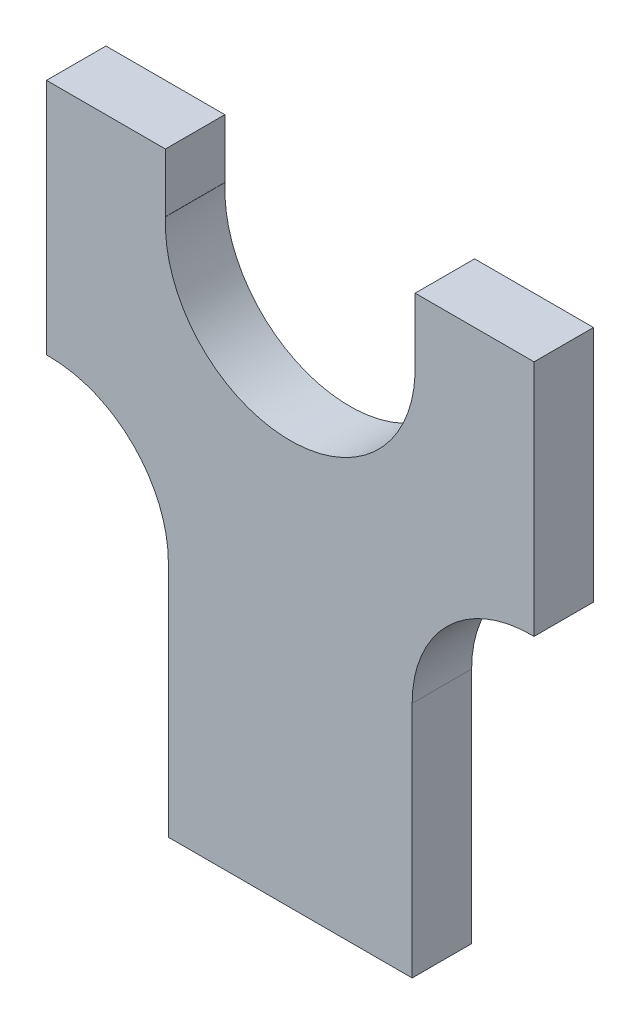
ISO-10303-21;
HEADER;
FILE_DESCRIPTION(('STEP AP214'),'2;1');
FILE_NAME('part.step','',(''),(''),'','','');
FILE_SCHEMA(('AUTOMOTIVE_DESIGN { 1 0 10303 214 1 1 1 1 }'));
ENDSEC;
DATA;
#1=APPLICATION_CONTEXT('core data for automotive mechanical design processes');
#2=APPLICATION_PROTOCOL_DEFINITION('international standard','automotive_design',2000,#1);
#3=PRODUCT_CONTEXT('',#1,'mechanical');
#4=PRODUCT('Part','Part','',(#3));
#5=PRODUCT_RELATED_PRODUCT_CATEGORY('part','',(#4));
#6=PRODUCT_DEFINITION_FORMATION('','',#4);
#7=PRODUCT_DEFINITION_CONTEXT('part definition',#1,'design');
#8=PRODUCT_DEFINITION('design','',#6,#7);
#9=PRODUCT_DEFINITION_SHAPE('','',#8);
#10=(LENGTH_UNIT() NAMED_UNIT(*) SI_UNIT(.MILLI.,.METRE.));
#11=(NAMED_UNIT(*) PLANE_ANGLE_UNIT() SI_UNIT($,.RADIAN.));
#12=(NAMED_UNIT(*) SI_UNIT($,.STERADIAN.) SOLID_ANGLE_UNIT());
#13=UNCERTAINTY_MEASURE_WITH_UNIT(LENGTH_MEASURE(1.E-05),#10,'distance_accuracy_value','');
#14=(GEOMETRIC_REPRESENTATION_CONTEXT(3) GLOBAL_UNCERTAINTY_ASSIGNED_CONTEXT((#13)) GLOBAL_UNIT_ASSIGNED_CONTEXT((#10,
#11,#12)) REPRESENTATION_CONTEXT('',''));
#15=CARTESIAN_POINT('',(0.,0.,0.));
#16=DIRECTION('',(0.,0.,1.));
#17=DIRECTION('',(1.,0.,0.));
#18=AXIS2_PLACEMENT_3D('',#15,#16,#17);
#19=CARTESIAN_POINT('',(-195.000000000006,500.,50.));
#20=DIRECTION('',(0.,-1.,0.));
#21=DIRECTION('',(0.,0.,-1.));
#22=AXIS2_PLACEMENT_3D('',#19,#20,#21);
#23=PLANE('',#22);
#24=DIRECTION('',(0.,0.,-1.));
#25=VECTOR('',#24,1.);
#26=CARTESIAN_POINT('',(-105.,500.,50.));
#27=LINE('',#26,#25);
#28=CARTESIAN_POINT('',(-105.,500.,50.));
#29=VERTEX_POINT('',#28);
#30=CARTESIAN_POINT('',(-105.,500.,0.));
#31=VERTEX_POINT('',#30);
#32=EDGE_CURVE('E159',#29,#31,#27,.T.);
#33=ORIENTED_EDGE('',*,*,#32,.T.);
#34=DIRECTION('',(-1.,0.,0.));
#35=VECTOR('',#34,1.);
#36=CARTESIAN_POINT('',(-195.000000000006,500.,0.));
#37=LINE('',#36,#35);
#38=CARTESIAN_POINT('',(-205.,500.,0.));
#39=VERTEX_POINT('',#38);
#40=EDGE_CURVE('E227',#31,#39,#37,.T.);
#41=ORIENTED_EDGE('',*,*,#40,.T.);
#42=DIRECTION('',(0.,0.,-1.));
#43=VECTOR('',#42,1.);
#44=CARTESIAN_POINT('',(-205.,500.,50.));
#45=LINE('',#44,#43);
#46=CARTESIAN_POINT('',(-205.,500.,50.));
#47=VERTEX_POINT('',#46);
#48=EDGE_CURVE('E189',#47,#39,#45,.T.);
#49=ORIENTED_EDGE('',*,*,#48,.F.);
#50=DIRECTION('',(-1.,0.,0.));
#51=VECTOR('',#50,1.);
#52=CARTESIAN_POINT('',(195.000000000006,500.,50.));
#53=LINE('',#52,#51);
#54=EDGE_CURVE('E204',#29,#47,#53,.T.);
#55=ORIENTED_EDGE('',*,*,#54,.F.);
#56=EDGE_LOOP('',(#33,#41,#49,#55));
#57=FACE_BOUND('',#56,.T.);
#58=ADVANCED_FACE('F41',(#57),#23,.F.);
#59=DIRECTION('',(0.,0.,-1.));
#60=VECTOR('',#59,1.);
#61=CARTESIAN_POINT('',(104.999999999995,500.,50.));
#62=LINE('',#61,#60);
#63=CARTESIAN_POINT('',(104.999999999995,500.,50.));
#64=VERTEX_POINT('',#63);
#65=CARTESIAN_POINT('',(104.999999999995,500.,0.));
#66=VERTEX_POINT('',#65);
#67=EDGE_CURVE('E185',#64,#66,#62,.T.);
#68=ORIENTED_EDGE('',*,*,#67,.F.);
#69=CARTESIAN_POINT('',(205.000000000008,500.,50.));
#70=VERTEX_POINT('',#69);
#71=EDGE_CURVE('E205',#70,#64,#53,.T.);
#72=ORIENTED_EDGE('',*,*,#71,.F.);
#73=DIRECTION('',(0.,0.,-1.));
#74=VECTOR('',#73,1.);
#75=CARTESIAN_POINT('',(205.000000000008,500.,50.));
#76=LINE('',#75,#74);
#77=CARTESIAN_POINT('',(205.000000000008,500.,0.));
#78=VERTEX_POINT('',#77);
#79=EDGE_CURVE('E192',#70,#78,#76,.T.);
#80=ORIENTED_EDGE('',*,*,#79,.T.);
#81=EDGE_CURVE('E228',#78,#66,#37,.T.);
#82=ORIENTED_EDGE('',*,*,#81,.T.);
#83=EDGE_LOOP('',(#68,#72,#80,#82));
#84=FACE_BOUND('',#83,.T.);
#85=ADVANCED_FACE('F319',(#84),#23,.F.);
#86=CARTESIAN_POINT('',(202.5,200.,50.));
#87=DIRECTION('',(0.,0.,-1.));
#88=DIRECTION('',(-1.,0.,0.));
#89=AXIS2_PLACEMENT_3D('',#86,#87,#88);
#90=PLANE('',#89);
#91=DIRECTION('',(0.,-1.,0.));
#92=VECTOR('',#91,1.);
#93=CARTESIAN_POINT('',(-105.,500.,50.));
#94=LINE('',#93,#92);
#95=CARTESIAN_POINT('',(-105.,450.696087881198,50.));
#96=VERTEX_POINT('',#95);
#97=EDGE_CURVE('E154',#29,#96,#94,.T.);
#98=ORIENTED_EDGE('',*,*,#97,.F.);
#99=ORIENTED_EDGE('',*,*,#54,.T.);
#100=DIRECTION('',(0.,-1.,0.));
#101=VECTOR('',#100,1.);
#102=CARTESIAN_POINT('',(-205.,300.,50.));
#103=LINE('',#102,#101);
#104=CARTESIAN_POINT('',(-205.,300.,50.));
#105=VERTEX_POINT('',#104);
#106=EDGE_CURVE('E208',#47,#105,#103,.T.);
#107=ORIENTED_EDGE('',*,*,#106,.T.);
#108=DIRECTION('',(1.,0.,0.));
#109=VECTOR('',#108,1.);
#110=CARTESIAN_POINT('',(-202.500000000001,300.,50.));
#111=LINE('',#110,#109);
#112=CARTESIAN_POINT('',(-202.500000000001,300.,50.));
#113=VERTEX_POINT('',#112);
#114=EDGE_CURVE('E210',#105,#113,#111,.T.);
#115=ORIENTED_EDGE('',*,*,#114,.T.);
#116=CARTESIAN_POINT('',(-202.5,200.,50.));
#117=DIRECTION('',(0.,0.,-1.));
#118=DIRECTION('',(1.,0.,0.));
#119=AXIS2_PLACEMENT_3D('',#116,#117,#118);
#120=CIRCLE('',#119,100.);
#121=CARTESIAN_POINT('',(-102.5,199.999999999999,50.));
#122=VERTEX_POINT('',#121);
#123=EDGE_CURVE('E212',#113,#122,#120,.T.);
#124=ORIENTED_EDGE('',*,*,#123,.T.);
#125=DIRECTION('',(0.,-1.,0.));
#126=VECTOR('',#125,1.);
#127=CARTESIAN_POINT('',(-102.5,0.,50.));
#128=LINE('',#127,#126);
#129=CARTESIAN_POINT('',(-102.5,0.,50.));
#130=VERTEX_POINT('',#129);
#131=EDGE_CURVE('E214',#122,#130,#128,.T.);
#132=ORIENTED_EDGE('',*,*,#131,.T.);
#133=DIRECTION('',(1.,0.,0.));
#134=VECTOR('',#133,1.);
#135=CARTESIAN_POINT('',(102.5,0.,50.));
#136=LINE('',#135,#134);
#137=CARTESIAN_POINT('',(102.5,0.,50.));
#138=VERTEX_POINT('',#137);
#139=EDGE_CURVE('E216',#130,#138,#136,.T.);
#140=ORIENTED_EDGE('',*,*,#139,.T.);
#141=DIRECTION('',(0.,1.,0.));
#142=VECTOR('',#141,1.);
#143=CARTESIAN_POINT('',(102.5,0.,50.));
#144=LINE('',#143,#142);
#145=CARTESIAN_POINT('',(102.5,199.999999999999,50.));
#146=VERTEX_POINT('',#145);
#147=EDGE_CURVE('E218',#138,#146,#144,.T.);
#148=ORIENTED_EDGE('',*,*,#147,.T.);
#149=CARTESIAN_POINT('',(202.5,200.,50.));
#150=DIRECTION('',(0.,0.,-1.));
#151=DIRECTION('',(-1.,0.,0.));
#152=AXIS2_PLACEMENT_3D('',#149,#150,#151);
#153=CIRCLE('',#152,100.);
#154=CARTESIAN_POINT('',(202.500000000001,300.,50.));
#155=VERTEX_POINT('',#154);
#156=EDGE_CURVE('E196',#146,#155,#153,.T.);
#157=ORIENTED_EDGE('',*,*,#156,.T.);
#158=DIRECTION('',(1.,0.,0.));
#159=VECTOR('',#158,1.);
#160=CARTESIAN_POINT('',(202.500000000001,300.,50.));
#161=LINE('',#160,#159);
#162=CARTESIAN_POINT('',(205.,300.,50.));
#163=VERTEX_POINT('',#162);
#164=EDGE_CURVE('E199',#155,#163,#161,.T.);
#165=ORIENTED_EDGE('',*,*,#164,.T.);
#166=DIRECTION('',(0.,1.,0.));
#167=VECTOR('',#166,1.);
#168=CARTESIAN_POINT('',(205.,300.,50.));
#169=LINE('',#168,#167);
#170=EDGE_CURVE('E202',#163,#70,#169,.T.);
#171=ORIENTED_EDGE('',*,*,#170,.T.);
#172=ORIENTED_EDGE('',*,*,#71,.T.);
#173=DIRECTION('',(-1.02738146572361E-13,1.,0.));
#174=VECTOR('',#173,1.);
#175=CARTESIAN_POINT('',(104.999999999995,500.,50.));
#176=LINE('',#175,#174);
#177=CARTESIAN_POINT('',(105.,450.696087881198,50.));
#178=VERTEX_POINT('',#177);
#179=EDGE_CURVE('E175',#178,#64,#176,.T.);
#180=ORIENTED_EDGE('',*,*,#179,.F.);
#181=DIRECTION('',(1.,0.,0.));
#182=VECTOR('',#181,1.);
#183=CARTESIAN_POINT('',(-105.,450.696087881198,50.));
#184=LINE('',#183,#182);
#185=CARTESIAN_POINT('',(104.85210050266,450.696087881198,50.));
#186=VERTEX_POINT('',#185);
#187=EDGE_CURVE('E162',#186,#178,#184,.T.);
#188=ORIENTED_EDGE('',*,*,#187,.F.);
#189=CARTESIAN_POINT('',(0.,445.124999999996,50.));
#190=DIRECTION('',(0.,0.,1.));
#191=DIRECTION('',(1.,0.,0.));
#192=AXIS2_PLACEMENT_3D('',#189,#190,#191);
#193=CIRCLE('',#192,105.);
#194=CARTESIAN_POINT('',(-104.85210050266,450.696087881198,50.));
#195=VERTEX_POINT('',#194);
#196=EDGE_CURVE('E168',#195,#186,#193,.T.);
#197=ORIENTED_EDGE('',*,*,#196,.F.);
#198=EDGE_CURVE('E63',#96,#195,#184,.T.);
#199=ORIENTED_EDGE('',*,*,#198,.F.);
#200=EDGE_LOOP('',(#98,#99,#107,#115,#124,#132,#140,#148,#157,#165,#171,#172,#180,#188,#197,#199));
#201=FACE_BOUND('',#200,.T.);
#202=ADVANCED_FACE('F172',(#201),#90,.F.);
#203=CARTESIAN_POINT('',(202.5,200.,0.));
#204=DIRECTION('',(0.,0.,-1.));
#205=DIRECTION('',(-1.,0.,0.));
#206=AXIS2_PLACEMENT_3D('',#203,#204,#205);
#207=PLANE('',#206);
#208=ORIENTED_EDGE('',*,*,#40,.F.);
#209=DIRECTION('',(0.,-1.,0.));
#210=VECTOR('',#209,1.);
#211=CARTESIAN_POINT('',(-105.,500.,0.));
#212=LINE('',#211,#210);
#213=CARTESIAN_POINT('',(-105.,450.696087881198,0.));
#214=VERTEX_POINT('',#213);
#215=EDGE_CURVE('E179',#31,#214,#212,.T.);
#216=ORIENTED_EDGE('',*,*,#215,.T.);
#217=DIRECTION('',(1.,0.,0.));
#218=VECTOR('',#217,1.);
#219=CARTESIAN_POINT('',(-105.,450.696087881198,0.));
#220=LINE('',#219,#218);
#221=CARTESIAN_POINT('',(-104.85210050266,450.696087881198,0.));
#222=VERTEX_POINT('',#221);
#223=EDGE_CURVE('E167',#214,#222,#220,.T.);
#224=ORIENTED_EDGE('',*,*,#223,.T.);
#225=CARTESIAN_POINT('',(0.,445.124999999996,0.));
#226=DIRECTION('',(0.,0.,-1.));
#227=DIRECTION('',(-1.,0.,0.));
#228=AXIS2_PLACEMENT_3D('',#225,#226,#227);
#229=CIRCLE('',#228,105.);
#230=CARTESIAN_POINT('',(104.85210050266,450.696087881198,0.));
#231=VERTEX_POINT('',#230);
#232=EDGE_CURVE('E265',#222,#231,#229,.F.);
#233=ORIENTED_EDGE('',*,*,#232,.T.);
#234=CARTESIAN_POINT('',(105.,450.696087881198,0.));
#235=VERTEX_POINT('',#234);
#236=EDGE_CURVE('E56',#231,#235,#220,.T.);
#237=ORIENTED_EDGE('',*,*,#236,.T.);
#238=DIRECTION('',(-1.02738146572361E-13,1.,0.));
#239=VECTOR('',#238,1.);
#240=CARTESIAN_POINT('',(104.999999999995,500.,0.));
#241=LINE('',#240,#239);
#242=EDGE_CURVE('E163',#235,#66,#241,.T.);
#243=ORIENTED_EDGE('',*,*,#242,.T.);
#244=ORIENTED_EDGE('',*,*,#81,.F.);
#245=DIRECTION('',(0.,1.,0.));
#246=VECTOR('',#245,1.);
#247=CARTESIAN_POINT('',(205.,300.,0.));
#248=LINE('',#247,#246);
#249=CARTESIAN_POINT('',(205.,300.,0.));
#250=VERTEX_POINT('',#249);
#251=EDGE_CURVE('E225',#250,#78,#248,.T.);
#252=ORIENTED_EDGE('',*,*,#251,.F.);
#253=DIRECTION('',(1.,0.,0.));
#254=VECTOR('',#253,1.);
#255=CARTESIAN_POINT('',(202.500000000001,300.,0.));
#256=LINE('',#255,#254);
#257=CARTESIAN_POINT('',(202.500000000001,300.,0.));
#258=VERTEX_POINT('',#257);
#259=EDGE_CURVE('E223',#258,#250,#256,.T.);
#260=ORIENTED_EDGE('',*,*,#259,.F.);
#261=CARTESIAN_POINT('',(202.5,200.,0.));
#262=DIRECTION('',(0.,0.,-1.));
#263=DIRECTION('',(-1.,0.,0.));
#264=AXIS2_PLACEMENT_3D('',#261,#262,#263);
#265=CIRCLE('',#264,100.);
#266=CARTESIAN_POINT('',(102.5,199.999999999999,0.));
#267=VERTEX_POINT('',#266);
#268=EDGE_CURVE('E195',#267,#258,#265,.T.);
#269=ORIENTED_EDGE('',*,*,#268,.F.);
#270=DIRECTION('',(0.,1.,0.));
#271=VECTOR('',#270,1.);
#272=CARTESIAN_POINT('',(102.5,0.,0.));
#273=LINE('',#272,#271);
#274=CARTESIAN_POINT('',(102.5,0.,0.));
#275=VERTEX_POINT('',#274);
#276=EDGE_CURVE('E200',#275,#267,#273,.T.);
#277=ORIENTED_EDGE('',*,*,#276,.F.);
#278=DIRECTION('',(1.,0.,0.));
#279=VECTOR('',#278,1.);
#280=CARTESIAN_POINT('',(102.5,0.,0.));
#281=LINE('',#280,#279);
#282=CARTESIAN_POINT('',(-102.5,0.,0.));
#283=VERTEX_POINT('',#282);
#284=EDGE_CURVE('E239',#283,#275,#281,.T.);
#285=ORIENTED_EDGE('',*,*,#284,.F.);
#286=DIRECTION('',(0.,-1.,0.));
#287=VECTOR('',#286,1.);
#288=CARTESIAN_POINT('',(-102.5,0.,0.));
#289=LINE('',#288,#287);
#290=CARTESIAN_POINT('',(-102.5,199.999999999999,0.));
#291=VERTEX_POINT('',#290);
#292=EDGE_CURVE('E237',#291,#283,#289,.T.);
#293=ORIENTED_EDGE('',*,*,#292,.F.);
#294=CARTESIAN_POINT('',(-202.5,200.,0.));
#295=DIRECTION('',(0.,0.,-1.));
#296=DIRECTION('',(1.,0.,0.));
#297=AXIS2_PLACEMENT_3D('',#294,#295,#296);
#298=CIRCLE('',#297,100.);
#299=CARTESIAN_POINT('',(-202.500000000001,300.,0.));
#300=VERTEX_POINT('',#299);
#301=EDGE_CURVE('E235',#300,#291,#298,.T.);
#302=ORIENTED_EDGE('',*,*,#301,.F.);
#303=DIRECTION('',(1.,0.,0.));
#304=VECTOR('',#303,1.);
#305=CARTESIAN_POINT('',(-202.500000000001,300.,0.));
#306=LINE('',#305,#304);
#307=CARTESIAN_POINT('',(-205.,300.,0.));
#308=VERTEX_POINT('',#307);
#309=EDGE_CURVE('E233',#308,#300,#306,.T.);
#310=ORIENTED_EDGE('',*,*,#309,.F.);
#311=DIRECTION('',(0.,-1.,0.));
#312=VECTOR('',#311,1.);
#313=CARTESIAN_POINT('',(-205.,300.,0.));
#314=LINE('',#313,#312);
#315=EDGE_CURVE('E231',#39,#308,#314,.T.);
#316=ORIENTED_EDGE('',*,*,#315,.F.);
#317=EDGE_LOOP('',(#208,#216,#224,#233,#237,#243,#244,#252,#260,#269,#277,#285,#293,#302,#310,#316));
#318=FACE_BOUND('',#317,.T.);
#319=ADVANCED_FACE('F272',(#318),#207,.T.);
#320=CARTESIAN_POINT('',(0.,445.124999999996,50.));
#321=DIRECTION('',(0.,0.,-1.));
#322=DIRECTION('',(-1.,0.,0.));
#323=AXIS2_PLACEMENT_3D('',#320,#321,#322);
#324=CYLINDRICAL_SURFACE('',#323,105.);
#325=ORIENTED_EDGE('',*,*,#196,.T.);
#326=DIRECTION('',(0.,0.,-1.));
#327=VECTOR('',#326,1.);
#328=CARTESIAN_POINT('',(104.85210050266,450.696087881198,50.));
#329=LINE('',#328,#327);
#330=EDGE_CURVE('E11',#186,#231,#329,.T.);
#331=ORIENTED_EDGE('',*,*,#330,.T.);
#332=ORIENTED_EDGE('',*,*,#232,.F.);
#333=DIRECTION('',(0.,0.,-1.));
#334=VECTOR('',#333,1.);
#335=CARTESIAN_POINT('',(-104.85210050266,450.696087881198,50.));
#336=LINE('',#335,#334);
#337=EDGE_CURVE('E49',#222,#195,#336,.F.);
#338=ORIENTED_EDGE('',*,*,#337,.T.);
#339=EDGE_LOOP('',(#325,#331,#332,#338));
#340=FACE_BOUND('',#339,.T.);
#341=ADVANCED_FACE('F269',(#340),#324,.F.);
#342=CARTESIAN_POINT('',(202.5,200.,50.));
#343=DIRECTION('',(0.,0.,-1.));
#344=DIRECTION('',(-1.,0.,0.));
#345=AXIS2_PLACEMENT_3D('',#342,#343,#344);
#346=CYLINDRICAL_SURFACE('',#345,100.);
#347=ORIENTED_EDGE('',*,*,#268,.T.);
#348=DIRECTION('',(0.,0.,-1.));
#349=VECTOR('',#348,1.);
#350=CARTESIAN_POINT('',(202.500000000001,300.,50.));
#351=LINE('',#350,#349);
#352=EDGE_CURVE('E262',#155,#258,#351,.T.);
#353=ORIENTED_EDGE('',*,*,#352,.F.);
#354=ORIENTED_EDGE('',*,*,#156,.F.);
#355=DIRECTION('',(0.,0.,-1.));
#356=VECTOR('',#355,1.);
#357=CARTESIAN_POINT('',(102.5,199.999999999999,50.));
#358=LINE('',#357,#356);
#359=EDGE_CURVE('E220',#146,#267,#358,.T.);
#360=ORIENTED_EDGE('',*,*,#359,.T.);
#361=EDGE_LOOP('',(#347,#353,#354,#360));
#362=FACE_BOUND('',#361,.T.);
#363=ADVANCED_FACE('F43',(#362),#346,.F.);
#364=CARTESIAN_POINT('',(202.500000000001,300.,50.));
#365=DIRECTION('',(0.,1.,0.));
#366=DIRECTION('',(0.,0.,1.));
#367=AXIS2_PLACEMENT_3D('',#364,#365,#366);
#368=PLANE('',#367);
#369=ORIENTED_EDGE('',*,*,#259,.T.);
#370=DIRECTION('',(0.,0.,-1.));
#371=VECTOR('',#370,1.);
#372=CARTESIAN_POINT('',(205.,300.,50.));
#373=LINE('',#372,#371);
#374=EDGE_CURVE('E259',#163,#250,#373,.T.);
#375=ORIENTED_EDGE('',*,*,#374,.F.);
#376=ORIENTED_EDGE('',*,*,#164,.F.);
#377=ORIENTED_EDGE('',*,*,#352,.T.);
#378=EDGE_LOOP('',(#369,#375,#376,#377));
#379=FACE_BOUND('',#378,.T.);
#380=ADVANCED_FACE('F310',(#379),#368,.F.);
#381=CARTESIAN_POINT('',(205.,300.,50.));
#382=DIRECTION('',(-1.,0.,0.));
#383=DIRECTION('',(0.,-1.,0.));
#384=AXIS2_PLACEMENT_3D('',#381,#382,#383);
#385=PLANE('',#384);
#386=ORIENTED_EDGE('',*,*,#251,.T.);
#387=ORIENTED_EDGE('',*,*,#79,.F.);
#388=ORIENTED_EDGE('',*,*,#170,.F.);
#389=ORIENTED_EDGE('',*,*,#374,.T.);
#390=EDGE_LOOP('',(#386,#387,#388,#389));
#391=FACE_BOUND('',#390,.T.);
#392=ADVANCED_FACE('F320',(#391),#385,.F.);
#393=CARTESIAN_POINT('',(-205.,300.,50.));
#394=DIRECTION('',(1.,0.,0.));
#395=DIRECTION('',(0.,1.,0.));
#396=AXIS2_PLACEMENT_3D('',#393,#394,#395);
#397=PLANE('',#396);
#398=ORIENTED_EDGE('',*,*,#315,.T.);
#399=DIRECTION('',(0.,0.,-1.));
#400=VECTOR('',#399,1.);
#401=CARTESIAN_POINT('',(-205.,300.,50.));
#402=LINE('',#401,#400);
#403=EDGE_CURVE('E256',#105,#308,#402,.T.);
#404=ORIENTED_EDGE('',*,*,#403,.F.);
#405=ORIENTED_EDGE('',*,*,#106,.F.);
#406=ORIENTED_EDGE('',*,*,#48,.T.);
#407=EDGE_LOOP('',(#398,#404,#405,#406));
#408=FACE_BOUND('',#407,.T.);
#409=ADVANCED_FACE('F279',(#408),#397,.F.);
#410=CARTESIAN_POINT('',(-202.500000000001,300.,50.));
#411=DIRECTION('',(0.,1.,0.));
#412=DIRECTION('',(0.,0.,1.));
#413=AXIS2_PLACEMENT_3D('',#410,#411,#412);
#414=PLANE('',#413);
#415=ORIENTED_EDGE('',*,*,#309,.T.);
#416=DIRECTION('',(0.,0.,-1.));
#417=VECTOR('',#416,1.);
#418=CARTESIAN_POINT('',(-202.500000000001,300.,50.));
#419=LINE('',#418,#417);
#420=EDGE_CURVE('E253',#113,#300,#419,.T.);
#421=ORIENTED_EDGE('',*,*,#420,.F.);
#422=ORIENTED_EDGE('',*,*,#114,.F.);
#423=ORIENTED_EDGE('',*,*,#403,.T.);
#424=EDGE_LOOP('',(#415,#421,#422,#423));
#425=FACE_BOUND('',#424,.T.);
#426=ADVANCED_FACE('F284',(#425),#414,.F.);
#427=CARTESIAN_POINT('',(-202.5,200.,50.));
#428=DIRECTION('',(0.,0.,-1.));
#429=DIRECTION('',(-1.,0.,0.));
#430=AXIS2_PLACEMENT_3D('',#427,#428,#429);
#431=CYLINDRICAL_SURFACE('',#430,100.);
#432=ORIENTED_EDGE('',*,*,#301,.T.);
#433=DIRECTION('',(0.,0.,-1.));
#434=VECTOR('',#433,1.);
#435=CARTESIAN_POINT('',(-102.5,199.999999999999,50.));
#436=LINE('',#435,#434);
#437=EDGE_CURVE('E250',#122,#291,#436,.T.);
#438=ORIENTED_EDGE('',*,*,#437,.F.);
#439=ORIENTED_EDGE('',*,*,#123,.F.);
#440=ORIENTED_EDGE('',*,*,#420,.T.);
#441=EDGE_LOOP('',(#432,#438,#439,#440));
#442=FACE_BOUND('',#441,.T.);
#443=ADVANCED_FACE('F290',(#442),#431,.F.);
#444=CARTESIAN_POINT('',(-102.5,0.,50.));
#445=DIRECTION('',(1.,0.,0.));
#446=DIRECTION('',(0.,1.,0.));
#447=AXIS2_PLACEMENT_3D('',#444,#445,#446);
#448=PLANE('',#447);
#449=ORIENTED_EDGE('',*,*,#292,.T.);
#450=DIRECTION('',(0.,0.,-1.));
#451=VECTOR('',#450,1.);
#452=CARTESIAN_POINT('',(-102.5,0.,50.));
#453=LINE('',#452,#451);
#454=EDGE_CURVE('E247',#130,#283,#453,.T.);
#455=ORIENTED_EDGE('',*,*,#454,.F.);
#456=ORIENTED_EDGE('',*,*,#131,.F.);
#457=ORIENTED_EDGE('',*,*,#437,.T.);
#458=EDGE_LOOP('',(#449,#455,#456,#457));
#459=FACE_BOUND('',#458,.T.);
#460=ADVANCED_FACE('F294',(#459),#448,.F.);
#461=CARTESIAN_POINT('',(102.5,0.,50.));
#462=DIRECTION('',(0.,1.,0.));
#463=DIRECTION('',(0.,0.,1.));
#464=AXIS2_PLACEMENT_3D('',#461,#462,#463);
#465=PLANE('',#464);
#466=ORIENTED_EDGE('',*,*,#284,.T.);
#467=DIRECTION('',(0.,0.,-1.));
#468=VECTOR('',#467,1.);
#469=CARTESIAN_POINT('',(102.5,0.,50.));
#470=LINE('',#469,#468);
#471=EDGE_CURVE('E244',#138,#275,#470,.T.);
#472=ORIENTED_EDGE('',*,*,#471,.F.);
#473=ORIENTED_EDGE('',*,*,#139,.F.);
#474=ORIENTED_EDGE('',*,*,#454,.T.);
#475=EDGE_LOOP('',(#466,#472,#473,#474));
#476=FACE_BOUND('',#475,.T.);
#477=ADVANCED_FACE('F299',(#476),#465,.F.);
#478=CARTESIAN_POINT('',(102.5,0.,50.));
#479=DIRECTION('',(-1.,0.,0.));
#480=DIRECTION('',(0.,-1.,0.));
#481=AXIS2_PLACEMENT_3D('',#478,#479,#480);
#482=PLANE('',#481);
#483=ORIENTED_EDGE('',*,*,#276,.T.);
#484=ORIENTED_EDGE('',*,*,#359,.F.);
#485=ORIENTED_EDGE('',*,*,#147,.F.);
#486=ORIENTED_EDGE('',*,*,#471,.T.);
#487=EDGE_LOOP('',(#483,#484,#485,#486));
#488=FACE_BOUND('',#487,.T.);
#489=ADVANCED_FACE('F305',(#488),#482,.F.);
#490=CARTESIAN_POINT('',(-105.,450.696087881198,50.));
#491=DIRECTION('',(0.,1.,0.));
#492=DIRECTION('',(0.,0.,1.));
#493=AXIS2_PLACEMENT_3D('',#490,#491,#492);
#494=PLANE('',#493);
#495=ORIENTED_EDGE('',*,*,#223,.F.);
#496=DIRECTION('',(0.,0.,-1.));
#497=VECTOR('',#496,1.);
#498=CARTESIAN_POINT('',(-105.,450.696087881198,50.));
#499=LINE('',#498,#497);
#500=EDGE_CURVE('E156',#96,#214,#499,.T.);
#501=ORIENTED_EDGE('',*,*,#500,.F.);
#502=ORIENTED_EDGE('',*,*,#198,.T.);
#503=ORIENTED_EDGE('',*,*,#337,.F.);
#504=EDGE_LOOP('',(#495,#501,#502,#503));
#505=FACE_BOUND('',#504,.T.);
#506=ADVANCED_FACE('F165',(#505),#494,.T.);
#507=CARTESIAN_POINT('',(-105.,500.,50.));
#508=DIRECTION('',(1.,0.,0.));
#509=DIRECTION('',(0.,0.,-1.));
#510=AXIS2_PLACEMENT_3D('',#507,#508,#509);
#511=PLANE('',#510);
#512=ORIENTED_EDGE('',*,*,#215,.F.);
#513=ORIENTED_EDGE('',*,*,#32,.F.);
#514=ORIENTED_EDGE('',*,*,#97,.T.);
#515=ORIENTED_EDGE('',*,*,#500,.T.);
#516=EDGE_LOOP('',(#512,#513,#514,#515));
#517=FACE_BOUND('',#516,.T.);
#518=ADVANCED_FACE('F155',(#517),#511,.T.);
#519=ORIENTED_EDGE('',*,*,#187,.T.);
#520=DIRECTION('',(0.,0.,-1.));
#521=VECTOR('',#520,1.);
#522=CARTESIAN_POINT('',(105.,450.696087881198,50.));
#523=LINE('',#522,#521);
#524=EDGE_CURVE('E169',#178,#235,#523,.T.);
#525=ORIENTED_EDGE('',*,*,#524,.T.);
#526=ORIENTED_EDGE('',*,*,#236,.F.);
#527=ORIENTED_EDGE('',*,*,#330,.F.);
#528=EDGE_LOOP('',(#519,#525,#526,#527));
#529=FACE_BOUND('',#528,.T.);
#530=ADVANCED_FACE('F327',(#529),#494,.T.);
#531=CARTESIAN_POINT('',(104.999999999995,500.,50.));
#532=DIRECTION('',(-1.,-1.02738146572361E-13,0.));
#533=DIRECTION('',(1.02738146572361E-13,-1.,0.));
#534=AXIS2_PLACEMENT_3D('',#531,#532,#533);
#535=PLANE('',#534);
#536=ORIENTED_EDGE('',*,*,#242,.F.);
#537=ORIENTED_EDGE('',*,*,#524,.F.);
#538=ORIENTED_EDGE('',*,*,#179,.T.);
#539=ORIENTED_EDGE('',*,*,#67,.T.);
#540=EDGE_LOOP('',(#536,#537,#538,#539));
#541=FACE_BOUND('',#540,.T.);
#542=ADVANCED_FACE('F326',(#541),#535,.T.);
#543=CLOSED_SHELL('',(#58,#85,#202,#319,#341,#363,#380,#392,#409,#426,#443,#460,#477,#489,#506,
#518,#530,#542));
#544=MANIFOLD_SOLID_BREP('B2',#543);
#545=ADVANCED_BREP_SHAPE_REPRESENTATION('',(#18,#544),#14);
#546=SHAPE_DEFINITION_REPRESENTATION(#9,#545);
ENDSEC;
END-ISO-10303-21;
